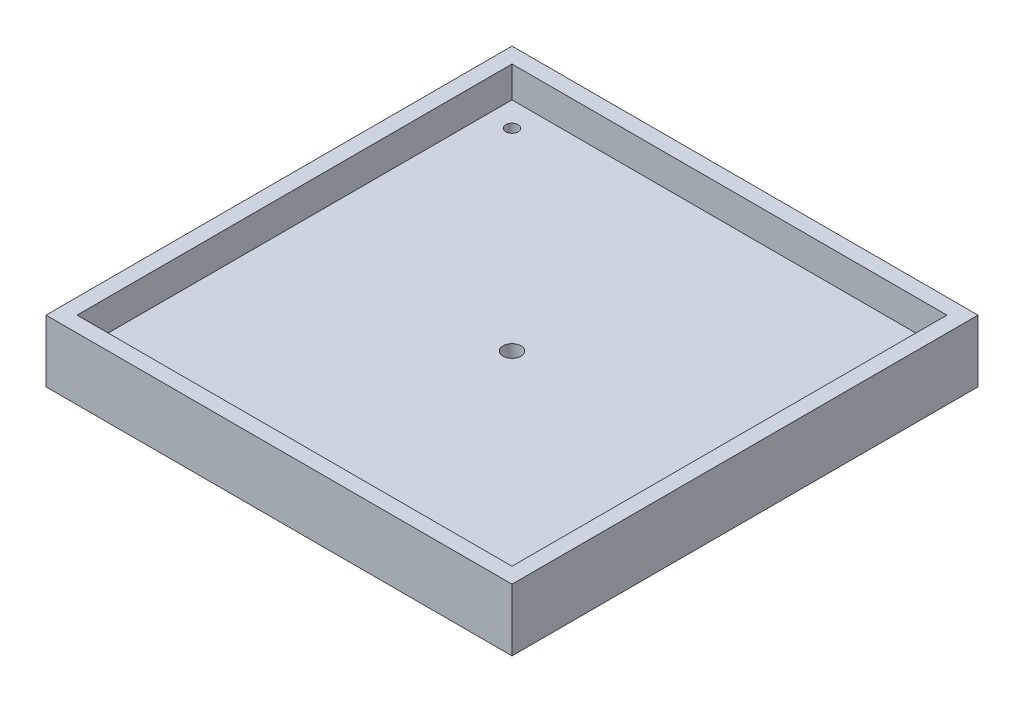
ISO-10303-21;
HEADER;
FILE_DESCRIPTION(('STEP AP214'),'2;1');
FILE_NAME('part.step','',(''),(''),'','','');
FILE_SCHEMA(('AUTOMOTIVE_DESIGN { 1 0 10303 214 1 1 1 1 }'));
ENDSEC;
DATA;
#1=APPLICATION_CONTEXT('core data for automotive mechanical design processes');
#2=APPLICATION_PROTOCOL_DEFINITION('international standard','automotive_design',2000,#1);
#3=PRODUCT_CONTEXT('',#1,'mechanical');
#4=PRODUCT('Part','Part','',(#3));
#5=PRODUCT_RELATED_PRODUCT_CATEGORY('part','',(#4));
#6=PRODUCT_DEFINITION_FORMATION('','',#4);
#7=PRODUCT_DEFINITION_CONTEXT('part definition',#1,'design');
#8=PRODUCT_DEFINITION('design','',#6,#7);
#9=PRODUCT_DEFINITION_SHAPE('','',#8);
#10=(LENGTH_UNIT() NAMED_UNIT(*) SI_UNIT(.MILLI.,.METRE.));
#11=(NAMED_UNIT(*) PLANE_ANGLE_UNIT() SI_UNIT($,.RADIAN.));
#12=(NAMED_UNIT(*) SI_UNIT($,.STERADIAN.) SOLID_ANGLE_UNIT());
#13=UNCERTAINTY_MEASURE_WITH_UNIT(LENGTH_MEASURE(1.E-05),#10,'distance_accuracy_value','');
#14=(GEOMETRIC_REPRESENTATION_CONTEXT(3) GLOBAL_UNCERTAINTY_ASSIGNED_CONTEXT((#13)) GLOBAL_UNIT_ASSIGNED_CONTEXT((#10,
#11,#12)) REPRESENTATION_CONTEXT('',''));
#15=CARTESIAN_POINT('',(0.,0.,0.));
#16=DIRECTION('',(0.,0.,1.));
#17=DIRECTION('',(1.,0.,0.));
#18=AXIS2_PLACEMENT_3D('',#15,#16,#17);
#19=CARTESIAN_POINT('',(0.,20.,-70.));
#20=DIRECTION('',(0.,0.,-1.));
#21=DIRECTION('',(-1.,0.,0.));
#22=AXIS2_PLACEMENT_3D('',#19,#20,#21);
#23=PLANE('',#22);
#24=DIRECTION('',(0.,-1.,0.));
#25=VECTOR('',#24,1.);
#26=CARTESIAN_POINT('',(-70.,20.,-70.));
#27=LINE('',#26,#25);
#28=CARTESIAN_POINT('',(-70.,20.,-70.));
#29=VERTEX_POINT('',#28);
#30=CARTESIAN_POINT('',(-70.,10.,-70.));
#31=VERTEX_POINT('',#30);
#32=EDGE_CURVE('E128',#29,#31,#27,.T.);
#33=ORIENTED_EDGE('',*,*,#32,.T.);
#34=DIRECTION('',(1.,0.,0.));
#35=VECTOR('',#34,1.);
#36=CARTESIAN_POINT('',(0.,10.,-70.));
#37=LINE('',#36,#35);
#38=CARTESIAN_POINT('',(70.,10.,-70.));
#39=VERTEX_POINT('',#38);
#40=EDGE_CURVE('E67',#31,#39,#37,.T.);
#41=ORIENTED_EDGE('',*,*,#40,.T.);
#42=DIRECTION('',(0.,-1.,0.));
#43=VECTOR('',#42,1.);
#44=CARTESIAN_POINT('',(70.,20.,-70.));
#45=LINE('',#44,#43);
#46=CARTESIAN_POINT('',(70.,20.,-70.));
#47=VERTEX_POINT('',#46);
#48=EDGE_CURVE('E12',#47,#39,#45,.T.);
#49=ORIENTED_EDGE('',*,*,#48,.F.);
#50=DIRECTION('',(1.,0.,0.));
#51=VECTOR('',#50,1.);
#52=CARTESIAN_POINT('',(0.,20.,-70.));
#53=LINE('',#52,#51);
#54=EDGE_CURVE('E167',#29,#47,#53,.T.);
#55=ORIENTED_EDGE('',*,*,#54,.F.);
#56=EDGE_LOOP('',(#33,#41,#49,#55));
#57=FACE_BOUND('',#56,.T.);
#58=ADVANCED_FACE('F50',(#57),#23,.F.);
#59=CARTESIAN_POINT('',(70.,20.,0.));
#60=DIRECTION('',(1.,0.,0.));
#61=DIRECTION('',(0.,0.,-1.));
#62=AXIS2_PLACEMENT_3D('',#59,#60,#61);
#63=PLANE('',#62);
#64=ORIENTED_EDGE('',*,*,#48,.T.);
#65=DIRECTION('',(0.,0.,1.));
#66=VECTOR('',#65,1.);
#67=CARTESIAN_POINT('',(70.,10.,0.));
#68=LINE('',#67,#66);
#69=CARTESIAN_POINT('',(70.,10.,70.));
#70=VERTEX_POINT('',#69);
#71=EDGE_CURVE('E73',#39,#70,#68,.T.);
#72=ORIENTED_EDGE('',*,*,#71,.T.);
#73=DIRECTION('',(0.,-1.,0.));
#74=VECTOR('',#73,1.);
#75=CARTESIAN_POINT('',(70.,20.,70.));
#76=LINE('',#75,#74);
#77=CARTESIAN_POINT('',(70.,20.,70.));
#78=VERTEX_POINT('',#77);
#79=EDGE_CURVE('E59',#78,#70,#76,.T.);
#80=ORIENTED_EDGE('',*,*,#79,.F.);
#81=DIRECTION('',(0.,0.,1.));
#82=VECTOR('',#81,1.);
#83=CARTESIAN_POINT('',(70.,20.,0.));
#84=LINE('',#83,#82);
#85=EDGE_CURVE('E170',#47,#78,#84,.T.);
#86=ORIENTED_EDGE('',*,*,#85,.F.);
#87=EDGE_LOOP('',(#64,#72,#80,#86));
#88=FACE_BOUND('',#87,.T.);
#89=ADVANCED_FACE('F218',(#88),#63,.F.);
#90=CARTESIAN_POINT('',(0.,20.,70.));
#91=DIRECTION('',(0.,0.,-1.));
#92=DIRECTION('',(-1.,0.,0.));
#93=AXIS2_PLACEMENT_3D('',#90,#91,#92);
#94=PLANE('',#93);
#95=DIRECTION('',(1.,0.,0.));
#96=VECTOR('',#95,1.);
#97=CARTESIAN_POINT('',(0.,10.,70.));
#98=LINE('',#97,#96);
#99=CARTESIAN_POINT('',(-70.,10.,70.));
#100=VERTEX_POINT('',#99);
#101=EDGE_CURVE('E131',#100,#70,#98,.T.);
#102=ORIENTED_EDGE('',*,*,#101,.F.);
#103=DIRECTION('',(0.,-1.,0.));
#104=VECTOR('',#103,1.);
#105=CARTESIAN_POINT('',(-70.,20.,70.));
#106=LINE('',#105,#104);
#107=CARTESIAN_POINT('',(-70.,20.,70.));
#108=VERTEX_POINT('',#107);
#109=EDGE_CURVE('E118',#108,#100,#106,.T.);
#110=ORIENTED_EDGE('',*,*,#109,.F.);
#111=DIRECTION('',(1.,0.,0.));
#112=VECTOR('',#111,1.);
#113=CARTESIAN_POINT('',(0.,20.,70.));
#114=LINE('',#113,#112);
#115=EDGE_CURVE('E172',#108,#78,#114,.T.);
#116=ORIENTED_EDGE('',*,*,#115,.T.);
#117=ORIENTED_EDGE('',*,*,#79,.T.);
#118=EDGE_LOOP('',(#102,#110,#116,#117));
#119=FACE_BOUND('',#118,.T.);
#120=ADVANCED_FACE('F132',(#119),#94,.T.);
#121=CARTESIAN_POINT('',(0.,20.,75.));
#122=DIRECTION('',(0.,0.,-1.));
#123=DIRECTION('',(-1.,0.,0.));
#124=AXIS2_PLACEMENT_3D('',#121,#122,#123);
#125=PLANE('',#124);
#126=DIRECTION('',(1.,0.,0.));
#127=VECTOR('',#126,1.);
#128=CARTESIAN_POINT('',(0.,0.,75.));
#129=LINE('',#128,#127);
#130=CARTESIAN_POINT('',(-75.,0.,75.));
#131=VERTEX_POINT('',#130);
#132=CARTESIAN_POINT('',(75.,0.,75.));
#133=VERTEX_POINT('',#132);
#134=EDGE_CURVE('E134',#131,#133,#129,.T.);
#135=ORIENTED_EDGE('',*,*,#134,.T.);
#136=DIRECTION('',(0.,-1.,0.));
#137=VECTOR('',#136,1.);
#138=CARTESIAN_POINT('',(75.,20.,75.));
#139=LINE('',#138,#137);
#140=CARTESIAN_POINT('',(75.,20.,75.));
#141=VERTEX_POINT('',#140);
#142=EDGE_CURVE('E186',#141,#133,#139,.T.);
#143=ORIENTED_EDGE('',*,*,#142,.F.);
#144=DIRECTION('',(1.,0.,0.));
#145=VECTOR('',#144,1.);
#146=CARTESIAN_POINT('',(0.,20.,75.));
#147=LINE('',#146,#145);
#148=CARTESIAN_POINT('',(-75.,20.,75.));
#149=VERTEX_POINT('',#148);
#150=EDGE_CURVE('E155',#149,#141,#147,.T.);
#151=ORIENTED_EDGE('',*,*,#150,.F.);
#152=DIRECTION('',(0.,-1.,0.));
#153=VECTOR('',#152,1.);
#154=CARTESIAN_POINT('',(-75.,20.,75.));
#155=LINE('',#154,#153);
#156=EDGE_CURVE('E175',#149,#131,#155,.T.);
#157=ORIENTED_EDGE('',*,*,#156,.T.);
#158=EDGE_LOOP('',(#135,#143,#151,#157));
#159=FACE_BOUND('',#158,.T.);
#160=ADVANCED_FACE('F52',(#159),#125,.F.);
#161=CARTESIAN_POINT('',(75.,20.,0.));
#162=DIRECTION('',(-1.,0.,0.));
#163=DIRECTION('',(0.,0.,1.));
#164=AXIS2_PLACEMENT_3D('',#161,#162,#163);
#165=PLANE('',#164);
#166=DIRECTION('',(0.,0.,-1.));
#167=VECTOR('',#166,1.);
#168=CARTESIAN_POINT('',(75.,0.,0.));
#169=LINE('',#168,#167);
#170=CARTESIAN_POINT('',(75.,0.,-75.));
#171=VERTEX_POINT('',#170);
#172=EDGE_CURVE('E178',#133,#171,#169,.T.);
#173=ORIENTED_EDGE('',*,*,#172,.T.);
#174=DIRECTION('',(0.,-1.,0.));
#175=VECTOR('',#174,1.);
#176=CARTESIAN_POINT('',(75.,20.,-75.));
#177=LINE('',#176,#175);
#178=CARTESIAN_POINT('',(75.,20.,-75.));
#179=VERTEX_POINT('',#178);
#180=EDGE_CURVE('E192',#179,#171,#177,.T.);
#181=ORIENTED_EDGE('',*,*,#180,.F.);
#182=DIRECTION('',(0.,0.,-1.));
#183=VECTOR('',#182,1.);
#184=CARTESIAN_POINT('',(75.,20.,0.));
#185=LINE('',#184,#183);
#186=EDGE_CURVE('E158',#141,#179,#185,.T.);
#187=ORIENTED_EDGE('',*,*,#186,.F.);
#188=ORIENTED_EDGE('',*,*,#142,.T.);
#189=EDGE_LOOP('',(#173,#181,#187,#188));
#190=FACE_BOUND('',#189,.T.);
#191=ADVANCED_FACE('F196',(#190),#165,.F.);
#192=CARTESIAN_POINT('',(0.,20.,-75.));
#193=DIRECTION('',(0.,0.,-1.));
#194=DIRECTION('',(-1.,0.,0.));
#195=AXIS2_PLACEMENT_3D('',#192,#193,#194);
#196=PLANE('',#195);
#197=DIRECTION('',(1.,0.,0.));
#198=VECTOR('',#197,1.);
#199=CARTESIAN_POINT('',(0.,0.,-75.));
#200=LINE('',#199,#198);
#201=CARTESIAN_POINT('',(-75.,0.,-75.));
#202=VERTEX_POINT('',#201);
#203=EDGE_CURVE('E181',#202,#171,#200,.T.);
#204=ORIENTED_EDGE('',*,*,#203,.F.);
#205=DIRECTION('',(0.,-1.,0.));
#206=VECTOR('',#205,1.);
#207=CARTESIAN_POINT('',(-75.,20.,-75.));
#208=LINE('',#207,#206);
#209=CARTESIAN_POINT('',(-75.,20.,-75.));
#210=VERTEX_POINT('',#209);
#211=EDGE_CURVE('E190',#210,#202,#208,.T.);
#212=ORIENTED_EDGE('',*,*,#211,.F.);
#213=DIRECTION('',(1.,0.,0.));
#214=VECTOR('',#213,1.);
#215=CARTESIAN_POINT('',(0.,20.,-75.));
#216=LINE('',#215,#214);
#217=EDGE_CURVE('E161',#210,#179,#216,.T.);
#218=ORIENTED_EDGE('',*,*,#217,.T.);
#219=ORIENTED_EDGE('',*,*,#180,.T.);
#220=EDGE_LOOP('',(#204,#212,#218,#219));
#221=FACE_BOUND('',#220,.T.);
#222=ADVANCED_FACE('F211',(#221),#196,.T.);
#223=CARTESIAN_POINT('',(-75.,20.,0.));
#224=DIRECTION('',(-1.,0.,0.));
#225=DIRECTION('',(0.,0.,1.));
#226=AXIS2_PLACEMENT_3D('',#223,#224,#225);
#227=PLANE('',#226);
#228=DIRECTION('',(0.,0.,-1.));
#229=VECTOR('',#228,1.);
#230=CARTESIAN_POINT('',(-75.,0.,0.));
#231=LINE('',#230,#229);
#232=EDGE_CURVE('E159',#131,#202,#231,.T.);
#233=ORIENTED_EDGE('',*,*,#232,.F.);
#234=ORIENTED_EDGE('',*,*,#156,.F.);
#235=DIRECTION('',(0.,0.,-1.));
#236=VECTOR('',#235,1.);
#237=CARTESIAN_POINT('',(-75.,20.,0.));
#238=LINE('',#237,#236);
#239=EDGE_CURVE('E164',#149,#210,#238,.T.);
#240=ORIENTED_EDGE('',*,*,#239,.T.);
#241=ORIENTED_EDGE('',*,*,#211,.T.);
#242=EDGE_LOOP('',(#233,#234,#240,#241));
#243=FACE_BOUND('',#242,.T.);
#244=ADVANCED_FACE('F206',(#243),#227,.T.);
#245=CARTESIAN_POINT('',(-70.,20.,0.));
#246=DIRECTION('',(1.,0.,0.));
#247=DIRECTION('',(0.,0.,-1.));
#248=AXIS2_PLACEMENT_3D('',#245,#246,#247);
#249=PLANE('',#248);
#250=DIRECTION('',(0.,0.,1.));
#251=VECTOR('',#250,1.);
#252=CARTESIAN_POINT('',(-70.,10.,0.));
#253=LINE('',#252,#251);
#254=EDGE_CURVE('E122',#31,#100,#253,.T.);
#255=ORIENTED_EDGE('',*,*,#254,.F.);
#256=ORIENTED_EDGE('',*,*,#32,.F.);
#257=DIRECTION('',(0.,0.,1.));
#258=VECTOR('',#257,1.);
#259=CARTESIAN_POINT('',(-70.,20.,0.));
#260=LINE('',#259,#258);
#261=EDGE_CURVE('E124',#29,#108,#260,.T.);
#262=ORIENTED_EDGE('',*,*,#261,.T.);
#263=ORIENTED_EDGE('',*,*,#109,.T.);
#264=EDGE_LOOP('',(#255,#256,#262,#263));
#265=FACE_BOUND('',#264,.T.);
#266=ADVANCED_FACE('F120',(#265),#249,.T.);
#267=CARTESIAN_POINT('',(0.,20.,0.));
#268=DIRECTION('',(0.,1.,0.));
#269=DIRECTION('',(0.,0.,1.));
#270=AXIS2_PLACEMENT_3D('',#267,#268,#269);
#271=PLANE('',#270);
#272=ORIENTED_EDGE('',*,*,#150,.T.);
#273=ORIENTED_EDGE('',*,*,#186,.T.);
#274=ORIENTED_EDGE('',*,*,#217,.F.);
#275=ORIENTED_EDGE('',*,*,#239,.F.);
#276=EDGE_LOOP('',(#272,#273,#274,#275));
#277=FACE_BOUND('',#276,.T.);
#278=ORIENTED_EDGE('',*,*,#54,.T.);
#279=ORIENTED_EDGE('',*,*,#85,.T.);
#280=ORIENTED_EDGE('',*,*,#115,.F.);
#281=ORIENTED_EDGE('',*,*,#261,.F.);
#282=EDGE_LOOP('',(#278,#279,#280,#281));
#283=FACE_BOUND('',#282,.T.);
#284=ADVANCED_FACE('F213',(#277,#283),#271,.T.);
#285=CARTESIAN_POINT('',(0.,0.,0.));
#286=DIRECTION('',(0.,1.,0.));
#287=DIRECTION('',(0.,0.,1.));
#288=AXIS2_PLACEMENT_3D('',#285,#286,#287);
#289=PLANE('',#288);
#290=CARTESIAN_POINT('',(0.,0.,0.));
#291=DIRECTION('',(0.,1.,0.));
#292=DIRECTION('',(0.,0.,1.));
#293=AXIS2_PLACEMENT_3D('',#290,#291,#292);
#294=CIRCLE('',#293,57.5);
#295=CARTESIAN_POINT('',(0.,0.,57.5));
#296=VERTEX_POINT('',#295);
#297=EDGE_CURVE('E231',#296,#296,#294,.T.);
#298=ORIENTED_EDGE('',*,*,#297,.T.);
#299=EDGE_LOOP('',(#298));
#300=FACE_BOUND('',#299,.T.);
#301=ORIENTED_EDGE('',*,*,#134,.F.);
#302=ORIENTED_EDGE('',*,*,#232,.T.);
#303=ORIENTED_EDGE('',*,*,#203,.T.);
#304=ORIENTED_EDGE('',*,*,#172,.F.);
#305=EDGE_LOOP('',(#301,#302,#303,#304));
#306=FACE_BOUND('',#305,.T.);
#307=CARTESIAN_POINT('',(-62.1,0.,-62.0999999999965));
#308=DIRECTION('',(0.,1.,0.));
#309=DIRECTION('',(0.,0.,1.));
#310=AXIS2_PLACEMENT_3D('',#307,#308,#309);
#311=CIRCLE('',#310,2.00000000000371);
#312=CARTESIAN_POINT('',(-62.1,0.,-60.0999999999928));
#313=VERTEX_POINT('',#312);
#314=EDGE_CURVE('E141',#313,#313,#311,.T.);
#315=ORIENTED_EDGE('',*,*,#314,.T.);
#316=EDGE_LOOP('',(#315));
#317=FACE_BOUND('',#316,.T.);
#318=CARTESIAN_POINT('',(-62.0999999999965,0.,62.1000000000034));
#319=DIRECTION('',(0.,1.,0.));
#320=DIRECTION('',(0.,0.,1.));
#321=AXIS2_PLACEMENT_3D('',#318,#319,#320);
#322=CIRCLE('',#321,2.00000000000257);
#323=CARTESIAN_POINT('',(-62.0999999999965,0.,64.100000000006));
#324=VERTEX_POINT('',#323);
#325=EDGE_CURVE('E144',#324,#324,#322,.T.);
#326=ORIENTED_EDGE('',*,*,#325,.T.);
#327=EDGE_LOOP('',(#326));
#328=FACE_BOUND('',#327,.T.);
#329=CARTESIAN_POINT('',(62.1000000000034,0.,62.1));
#330=DIRECTION('',(0.,1.,0.));
#331=DIRECTION('',(0.,0.,1.));
#332=AXIS2_PLACEMENT_3D('',#329,#330,#331);
#333=CIRCLE('',#332,1.99999999999915);
#334=CARTESIAN_POINT('',(62.1000000000034,0.,64.0999999999991));
#335=VERTEX_POINT('',#334);
#336=EDGE_CURVE('E148',#335,#335,#333,.T.);
#337=ORIENTED_EDGE('',*,*,#336,.T.);
#338=EDGE_LOOP('',(#337));
#339=FACE_BOUND('',#338,.T.);
#340=CARTESIAN_POINT('',(62.1,0.,-62.1));
#341=DIRECTION('',(0.,1.,0.));
#342=DIRECTION('',(0.,0.,1.));
#343=AXIS2_PLACEMENT_3D('',#340,#341,#342);
#344=CIRCLE('',#343,2.);
#345=CARTESIAN_POINT('',(62.1,0.,-60.1));
#346=VERTEX_POINT('',#345);
#347=EDGE_CURVE('E151',#346,#346,#344,.T.);
#348=ORIENTED_EDGE('',*,*,#347,.T.);
#349=EDGE_LOOP('',(#348));
#350=FACE_BOUND('',#349,.T.);
#351=ADVANCED_FACE('F203',(#300,#306,#317,#328,#339,#350),#289,.F.);
#352=CARTESIAN_POINT('',(62.1,10.,-62.1));
#353=DIRECTION('',(0.,-1.,0.));
#354=DIRECTION('',(0.,0.,-1.));
#355=AXIS2_PLACEMENT_3D('',#352,#353,#354);
#356=CYLINDRICAL_SURFACE('',#355,2.);
#357=CARTESIAN_POINT('',(62.1,10.,-62.1));
#358=DIRECTION('',(0.,1.,0.));
#359=DIRECTION('',(0.,0.,1.));
#360=AXIS2_PLACEMENT_3D('',#357,#358,#359);
#361=CIRCLE('',#360,2.);
#362=CARTESIAN_POINT('',(62.1,10.,-60.1));
#363=VERTEX_POINT('',#362);
#364=EDGE_CURVE('E219',#363,#363,#361,.T.);
#365=ORIENTED_EDGE('',*,*,#364,.T.);
#366=EDGE_LOOP('',(#365));
#367=FACE_BOUND('',#366,.T.);
#368=ORIENTED_EDGE('',*,*,#347,.F.);
#369=EDGE_LOOP('',(#368));
#370=FACE_BOUND('',#369,.T.);
#371=ADVANCED_FACE('F258',(#367,#370),#356,.F.);
#372=CARTESIAN_POINT('',(62.1000000000034,10.,62.1));
#373=DIRECTION('',(0.,-1.,0.));
#374=DIRECTION('',(0.,0.,-1.));
#375=AXIS2_PLACEMENT_3D('',#372,#373,#374);
#376=CYLINDRICAL_SURFACE('',#375,1.99999999999915);
#377=CARTESIAN_POINT('',(62.1000000000034,10.,62.1));
#378=DIRECTION('',(0.,1.,0.));
#379=DIRECTION('',(0.,0.,1.));
#380=AXIS2_PLACEMENT_3D('',#377,#378,#379);
#381=CIRCLE('',#380,1.99999999999915);
#382=CARTESIAN_POINT('',(62.1000000000034,10.,64.0999999999991));
#383=VERTEX_POINT('',#382);
#384=EDGE_CURVE('E221',#383,#383,#381,.T.);
#385=ORIENTED_EDGE('',*,*,#384,.T.);
#386=EDGE_LOOP('',(#385));
#387=FACE_BOUND('',#386,.T.);
#388=ORIENTED_EDGE('',*,*,#336,.F.);
#389=EDGE_LOOP('',(#388));
#390=FACE_BOUND('',#389,.T.);
#391=ADVANCED_FACE('F263',(#387,#390),#376,.F.);
#392=CARTESIAN_POINT('',(-62.0999999999965,10.,62.1000000000034));
#393=DIRECTION('',(0.,-1.,0.));
#394=DIRECTION('',(0.,0.,-1.));
#395=AXIS2_PLACEMENT_3D('',#392,#393,#394);
#396=CYLINDRICAL_SURFACE('',#395,2.00000000000257);
#397=CARTESIAN_POINT('',(-62.0999999999965,10.,62.1000000000034));
#398=DIRECTION('',(0.,1.,0.));
#399=DIRECTION('',(0.,0.,1.));
#400=AXIS2_PLACEMENT_3D('',#397,#398,#399);
#401=CIRCLE('',#400,2.00000000000257);
#402=CARTESIAN_POINT('',(-62.0999999999965,10.,64.100000000006));
#403=VERTEX_POINT('',#402);
#404=EDGE_CURVE('E226',#403,#403,#401,.T.);
#405=ORIENTED_EDGE('',*,*,#404,.T.);
#406=EDGE_LOOP('',(#405));
#407=FACE_BOUND('',#406,.T.);
#408=ORIENTED_EDGE('',*,*,#325,.F.);
#409=EDGE_LOOP('',(#408));
#410=FACE_BOUND('',#409,.T.);
#411=ADVANCED_FACE('F357',(#407,#410),#396,.F.);
#412=CARTESIAN_POINT('',(-62.1,10.,-62.0999999999965));
#413=DIRECTION('',(0.,-1.,0.));
#414=DIRECTION('',(0.,0.,-1.));
#415=AXIS2_PLACEMENT_3D('',#412,#413,#414);
#416=CYLINDRICAL_SURFACE('',#415,2.00000000000371);
#417=CARTESIAN_POINT('',(-62.1,10.,-62.0999999999965));
#418=DIRECTION('',(0.,1.,0.));
#419=DIRECTION('',(0.,0.,1.));
#420=AXIS2_PLACEMENT_3D('',#417,#418,#419);
#421=CIRCLE('',#420,2.00000000000371);
#422=CARTESIAN_POINT('',(-62.1,10.,-60.0999999999928));
#423=VERTEX_POINT('',#422);
#424=EDGE_CURVE('E154',#423,#423,#421,.T.);
#425=ORIENTED_EDGE('',*,*,#424,.T.);
#426=EDGE_LOOP('',(#425));
#427=FACE_BOUND('',#426,.T.);
#428=ORIENTED_EDGE('',*,*,#314,.F.);
#429=EDGE_LOOP('',(#428));
#430=FACE_BOUND('',#429,.T.);
#431=ADVANCED_FACE('F366',(#427,#430),#416,.F.);
#432=CARTESIAN_POINT('',(0.,10.,0.));
#433=DIRECTION('',(0.,1.,0.));
#434=DIRECTION('',(0.,0.,1.));
#435=AXIS2_PLACEMENT_3D('',#432,#433,#434);
#436=PLANE('',#435);
#437=CARTESIAN_POINT('',(0.,10.,0.));
#438=DIRECTION('',(0.,1.,0.));
#439=DIRECTION('',(0.,0.,1.));
#440=AXIS2_PLACEMENT_3D('',#437,#438,#439);
#441=CIRCLE('',#440,2.9);
#442=CARTESIAN_POINT('',(0.,10.,2.90000000000003));
#443=VERTEX_POINT('',#442);
#444=EDGE_CURVE('E236',#443,#443,#441,.T.);
#445=ORIENTED_EDGE('',*,*,#444,.F.);
#446=EDGE_LOOP('',(#445));
#447=FACE_BOUND('',#446,.T.);
#448=ORIENTED_EDGE('',*,*,#424,.F.);
#449=EDGE_LOOP('',(#448));
#450=FACE_BOUND('',#449,.T.);
#451=ORIENTED_EDGE('',*,*,#404,.F.);
#452=EDGE_LOOP('',(#451));
#453=FACE_BOUND('',#452,.T.);
#454=ORIENTED_EDGE('',*,*,#384,.F.);
#455=EDGE_LOOP('',(#454));
#456=FACE_BOUND('',#455,.T.);
#457=ORIENTED_EDGE('',*,*,#364,.F.);
#458=EDGE_LOOP('',(#457));
#459=FACE_BOUND('',#458,.T.);
#460=ORIENTED_EDGE('',*,*,#71,.F.);
#461=ORIENTED_EDGE('',*,*,#40,.F.);
#462=ORIENTED_EDGE('',*,*,#254,.T.);
#463=ORIENTED_EDGE('',*,*,#101,.T.);
#464=EDGE_LOOP('',(#460,#461,#462,#463));
#465=FACE_BOUND('',#464,.T.);
#466=ADVANCED_FACE('F136',(#447,#450,#453,#456,#459,#465),#436,.T.);
#467=CARTESIAN_POINT('',(0.,4.,0.));
#468=DIRECTION('',(0.,-1.,0.));
#469=DIRECTION('',(0.,0.,-1.));
#470=AXIS2_PLACEMENT_3D('',#467,#468,#469);
#471=CYLINDRICAL_SURFACE('',#470,57.5);
#472=CARTESIAN_POINT('',(0.,4.,0.));
#473=DIRECTION('',(0.,1.,0.));
#474=DIRECTION('',(0.,0.,1.));
#475=AXIS2_PLACEMENT_3D('',#472,#473,#474);
#476=CIRCLE('',#475,57.5);
#477=CARTESIAN_POINT('',(0.,4.,57.5));
#478=VERTEX_POINT('',#477);
#479=EDGE_CURVE('E145',#478,#478,#476,.T.);
#480=ORIENTED_EDGE('',*,*,#479,.T.);
#481=EDGE_LOOP('',(#480));
#482=FACE_BOUND('',#481,.T.);
#483=ORIENTED_EDGE('',*,*,#297,.F.);
#484=EDGE_LOOP('',(#483));
#485=FACE_BOUND('',#484,.T.);
#486=ADVANCED_FACE('F248',(#482,#485),#471,.F.);
#487=CARTESIAN_POINT('',(0.,4.,0.));
#488=DIRECTION('',(0.,1.,0.));
#489=DIRECTION('',(0.,0.,1.));
#490=AXIS2_PLACEMENT_3D('',#487,#488,#489);
#491=PLANE('',#490);
#492=CARTESIAN_POINT('',(0.,4.,0.));
#493=DIRECTION('',(0.,1.,0.));
#494=DIRECTION('',(0.,0.,1.));
#495=AXIS2_PLACEMENT_3D('',#492,#493,#494);
#496=CIRCLE('',#495,2.9);
#497=CARTESIAN_POINT('',(0.,4.,2.90000000000003));
#498=VERTEX_POINT('',#497);
#499=EDGE_CURVE('E54',#498,#498,#496,.F.);
#500=ORIENTED_EDGE('',*,*,#499,.F.);
#501=EDGE_LOOP('',(#500));
#502=FACE_BOUND('',#501,.T.);
#503=ORIENTED_EDGE('',*,*,#479,.F.);
#504=EDGE_LOOP('',(#503));
#505=FACE_BOUND('',#504,.T.);
#506=ADVANCED_FACE('F245',(#502,#505),#491,.F.);
#507=CARTESIAN_POINT('',(0.,10.,0.));
#508=DIRECTION('',(0.,-1.,0.));
#509=DIRECTION('',(0.,0.,-1.));
#510=AXIS2_PLACEMENT_3D('',#507,#508,#509);
#511=CYLINDRICAL_SURFACE('',#510,2.9);
#512=ORIENTED_EDGE('',*,*,#444,.T.);
#513=EDGE_LOOP('',(#512));
#514=FACE_BOUND('',#513,.T.);
#515=ORIENTED_EDGE('',*,*,#499,.T.);
#516=EDGE_LOOP('',(#515));
#517=FACE_BOUND('',#516,.T.);
#518=ADVANCED_FACE('F243',(#514,#517),#511,.F.);
#519=CLOSED_SHELL('',(#58,#89,#120,#160,#191,#222,#244,#266,#284,#351,#371,#391,#411,#431,#466,
#486,#506,#518));
#520=MANIFOLD_SOLID_BREP('B2',#519);
#521=ADVANCED_BREP_SHAPE_REPRESENTATION('',(#18,#520),#14);
#522=SHAPE_DEFINITION_REPRESENTATION(#9,#521);
ENDSEC;
END-ISO-10303-21;
